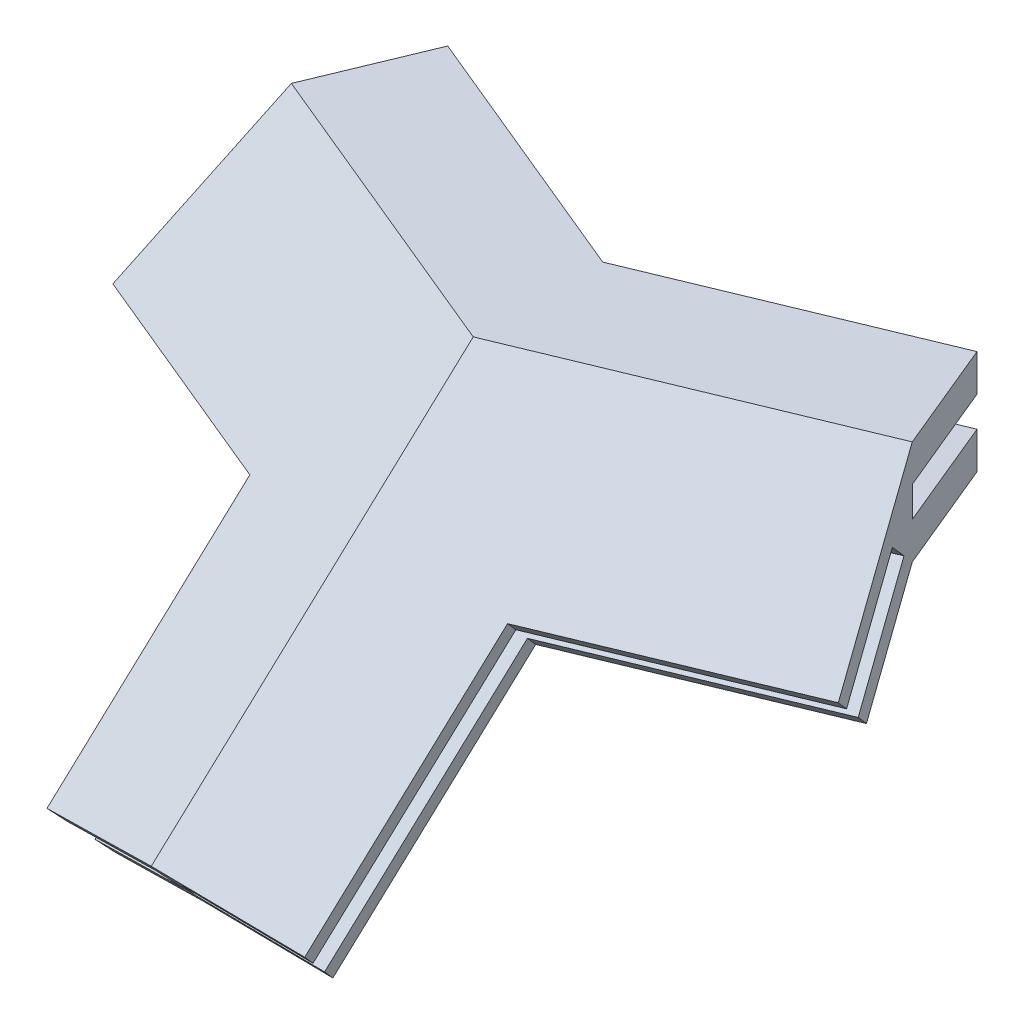
ISO-10303-21;
HEADER;
FILE_DESCRIPTION(('STEP AP214'),'2;1');
FILE_NAME('part.step','',(''),(''),'','','');
FILE_SCHEMA(('AUTOMOTIVE_DESIGN { 1 0 10303 214 1 1 1 1 }'));
ENDSEC;
DATA;
#1=APPLICATION_CONTEXT('core data for automotive mechanical design processes');
#2=APPLICATION_PROTOCOL_DEFINITION('international standard','automotive_design',2000,#1);
#3=PRODUCT_CONTEXT('',#1,'mechanical');
#4=PRODUCT('Part','Part','',(#3));
#5=PRODUCT_RELATED_PRODUCT_CATEGORY('part','',(#4));
#6=PRODUCT_DEFINITION_FORMATION('','',#4);
#7=PRODUCT_DEFINITION_CONTEXT('part definition',#1,'design');
#8=PRODUCT_DEFINITION('design','',#6,#7);
#9=PRODUCT_DEFINITION_SHAPE('','',#8);
#10=(LENGTH_UNIT() NAMED_UNIT(*) SI_UNIT(.MILLI.,.METRE.));
#11=(NAMED_UNIT(*) PLANE_ANGLE_UNIT() SI_UNIT($,.RADIAN.));
#12=(NAMED_UNIT(*) SI_UNIT($,.STERADIAN.) SOLID_ANGLE_UNIT());
#13=UNCERTAINTY_MEASURE_WITH_UNIT(LENGTH_MEASURE(1.E-05),#10,'distance_accuracy_value','');
#14=(GEOMETRIC_REPRESENTATION_CONTEXT(3) GLOBAL_UNCERTAINTY_ASSIGNED_CONTEXT((#13)) GLOBAL_UNIT_ASSIGNED_CONTEXT((#10,
#11,#12)) REPRESENTATION_CONTEXT('',''));
#15=CARTESIAN_POINT('',(0.,0.,0.));
#16=DIRECTION('',(0.,0.,1.));
#17=DIRECTION('',(1.,0.,0.));
#18=AXIS2_PLACEMENT_3D('',#15,#16,#17);
#19=CARTESIAN_POINT('',(-8.92826671022182,21.7801821562483,211.625005817447));
#20=DIRECTION('',(-0.270598050073097,0.707106781186551,-0.653281482438185));
#21=DIRECTION('',(0.,0.678598344545844,0.734509555267758));
#22=AXIS2_PLACEMENT_3D('',#19,#20,#21);
#23=PLANE('',#22);
#24=DIRECTION('',(-0.2705980500731,-0.707106781186544,-0.653281482438191));
#25=VECTOR('',#24,1.);
#26=CARTESIAN_POINT('',(35.6172582293641,21.7801821562483,193.173645244441));
#27=LINE('',#26,#25);
#28=CARTESIAN_POINT('',(36.2531636470359,23.4418830920367,194.708856728171));
#29=VERTEX_POINT('',#28);
#30=CARTESIAN_POINT('',(35.6172582293641,21.7801821562483,193.173645244441));
#31=VERTEX_POINT('',#30);
#32=EDGE_CURVE('E462',#29,#31,#27,.T.);
#33=ORIENTED_EDGE('',*,*,#32,.F.);
#34=DIRECTION('',(0.923879532511287,0.,-0.38268343236509));
#35=VECTOR('',#34,1.);
#36=CARTESIAN_POINT('',(-8.29236129255004,23.4418830920367,213.160217301176));
#37=LINE('',#36,#35);
#38=CARTESIAN_POINT('',(10.8502543306543,23.4418830920367,205.23108629075));
#39=VERTEX_POINT('',#38);
#40=EDGE_CURVE('E553',#39,#29,#37,.T.);
#41=ORIENTED_EDGE('',*,*,#40,.F.);
#42=DIRECTION('',(0.270598050073085,0.707106781186539,0.653281482438203));
#43=VECTOR('',#42,1.);
#44=CARTESIAN_POINT('',(10.8502543306543,23.4418830920367,205.23108629075));
#45=LINE('',#44,#43);
#46=CARTESIAN_POINT('',(10.2143489129825,21.7801821562483,203.69587480702));
#47=VERTEX_POINT('',#46);
#48=EDGE_CURVE('E495',#47,#39,#45,.T.);
#49=ORIENTED_EDGE('',*,*,#48,.F.);
#50=DIRECTION('',(0.923879532511287,0.,-0.38268343236509));
#51=VECTOR('',#50,1.);
#52=CARTESIAN_POINT('',(-8.92826671022182,21.7801821562483,211.625005817447));
#53=LINE('',#52,#51);
#54=EDGE_CURVE('E558',#47,#31,#53,.T.);
#55=ORIENTED_EDGE('',*,*,#54,.T.);
#56=EDGE_LOOP('',(#33,#41,#49,#55));
#57=FACE_BOUND('',#56,.T.);
#58=ADVANCED_FACE('F39',(#57),#23,.F.);
#59=DIRECTION('',(-0.2705980500731,-0.707106781186544,-0.653281482438191));
#60=VECTOR('',#59,1.);
#61=CARTESIAN_POINT('',(35.6172582293641,21.7801821562483,193.173645244441));
#62=LINE('',#61,#60);
#63=CARTESIAN_POINT('',(34.7269076718449,19.4535840278251,191.024148853212));
#64=VERTEX_POINT('',#63);
#65=CARTESIAN_POINT('',(34.0910022541732,17.7918830920368,189.488937369482));
#66=VERTEX_POINT('',#65);
#67=EDGE_CURVE('E447',#64,#66,#62,.T.);
#68=ORIENTED_EDGE('',*,*,#67,.F.);
#69=DIRECTION('',(0.923879532511287,0.,-0.38268343236509));
#70=VECTOR('',#69,1.);
#71=CARTESIAN_POINT('',(-9.81861726774101,19.4535840278251,209.475509426217));
#72=LINE('',#71,#70);
#73=CARTESIAN_POINT('',(9.32399835546334,19.4535840278251,201.546378415791));
#74=VERTEX_POINT('',#73);
#75=EDGE_CURVE('E569',#74,#64,#72,.T.);
#76=ORIENTED_EDGE('',*,*,#75,.F.);
#77=DIRECTION('',(0.270598050073098,0.707106781186542,0.653281482438194));
#78=VECTOR('',#77,1.);
#79=CARTESIAN_POINT('',(9.32399835546334,19.4535840278251,201.546378415791));
#80=LINE('',#79,#78);
#81=CARTESIAN_POINT('',(8.68809293779155,17.7918830920367,200.011166932061));
#82=VERTEX_POINT('',#81);
#83=EDGE_CURVE('E500',#82,#74,#80,.T.);
#84=ORIENTED_EDGE('',*,*,#83,.F.);
#85=DIRECTION('',(0.923879532511287,0.,-0.38268343236509));
#86=VECTOR('',#85,1.);
#87=CARTESIAN_POINT('',(-10.4545226854128,17.7918830920367,207.940297942488));
#88=LINE('',#87,#86);
#89=EDGE_CURVE('E535',#82,#66,#88,.T.);
#90=ORIENTED_EDGE('',*,*,#89,.T.);
#91=EDGE_LOOP('',(#68,#76,#84,#90));
#92=FACE_BOUND('',#91,.T.);
#93=ADVANCED_FACE('F613',(#92),#23,.F.);
#94=CARTESIAN_POINT('',(-12.4460413611721,30.9725703116735,203.13234654575));
#95=DIRECTION('',(0.270598050073101,0.70710678118654,0.653281482438195));
#96=DIRECTION('',(0.,-0.678598344545855,0.734509555267749));
#97=AXIS2_PLACEMENT_3D('',#94,#95,#96);
#98=PLANE('',#97);
#99=DIRECTION('',(-0.270598050073096,0.707106781186555,-0.653281482438182));
#100=VECTOR('',#99,1.);
#101=CARTESIAN_POINT('',(32.0994835784139,30.9725703116735,184.680985972745));
#102=LINE('',#101,#100);
#103=CARTESIAN_POINT('',(32.0994835784139,30.9725703116735,184.680985972745));
#104=VERTEX_POINT('',#103);
#105=EDGE_CURVE('E459',#31,#104,#102,.T.);
#106=ORIENTED_EDGE('',*,*,#105,.F.);
#107=ORIENTED_EDGE('',*,*,#54,.F.);
#108=DIRECTION('',(0.,0.678598344545852,-0.734509555267751));
#109=VECTOR('',#108,1.);
#110=CARTESIAN_POINT('',(10.2143489129825,1.42223181987276,225.731161465053));
#111=LINE('',#110,#109);
#112=CARTESIAN_POINT('',(10.2143489129825,1.42223181987276,225.731161465053));
#113=VERTEX_POINT('',#112);
#114=EDGE_CURVE('E518',#113,#47,#111,.T.);
#115=ORIENTED_EDGE('',*,*,#114,.F.);
#116=DIRECTION('',(-0.962692419881156,0.198756853415516,0.18362738881694));
#117=VECTOR('',#116,1.);
#118=CARTESIAN_POINT('',(-12.4460413611722,6.10068131739188,230.053485199699));
#119=LINE('',#118,#117);
#120=CARTESIAN_POINT('',(-1.79608500966418,3.90189822766997,228.022074506673));
#121=VERTEX_POINT('',#120);
#122=EDGE_CURVE('E488',#113,#121,#119,.T.);
#123=ORIENTED_EDGE('',*,*,#122,.T.);
#124=DIRECTION('',(0.,0.678598344545852,-0.734509555267751));
#125=VECTOR('',#124,1.);
#126=CARTESIAN_POINT('',(-1.79608500966419,19.2194404578549,211.442486269071));
#127=LINE('',#126,#125);
#128=CARTESIAN_POINT('',(-1.7960850096642,30.9725703116735,198.720990186274));
#129=VERTEX_POINT('',#128);
#130=EDGE_CURVE('E62',#121,#129,#127,.T.);
#131=ORIENTED_EDGE('',*,*,#130,.T.);
#132=DIRECTION('',(0.923879532511287,0.,-0.38268343236509));
#133=VECTOR('',#132,1.);
#134=CARTESIAN_POINT('',(-12.4460413611721,30.9725703116735,203.13234654575));
#135=LINE('',#134,#133);
#136=EDGE_CURVE('E562',#129,#104,#135,.T.);
#137=ORIENTED_EDGE('',*,*,#136,.T.);
#138=EDGE_LOOP('',(#106,#107,#115,#123,#131,#137));
#139=FACE_BOUND('',#138,.T.);
#140=ADVANCED_FACE('F598',(#139),#98,.F.);
#141=CARTESIAN_POINT('',(-13.3363919186913,28.6459721832503,200.982850154521));
#142=DIRECTION('',(-0.270598050073094,0.707106781186558,-0.653281482438178));
#143=DIRECTION('',(0.,0.678598344545836,0.734509555267766));
#144=AXIS2_PLACEMENT_3D('',#141,#142,#143);
#145=PLANE('',#144);
#146=DIRECTION('',(-0.270598050073103,-0.707106781186537,-0.653281482438198));
#147=VECTOR('',#146,1.);
#148=CARTESIAN_POINT('',(31.2091330208947,28.6459721832503,182.531489581516));
#149=LINE('',#148,#147);
#150=CARTESIAN_POINT('',(31.2091330208947,28.6459721832503,182.531489581516));
#151=VERTEX_POINT('',#150);
#152=EDGE_CURVE('E456',#104,#151,#149,.T.);
#153=ORIENTED_EDGE('',*,*,#152,.F.);
#154=ORIENTED_EDGE('',*,*,#136,.F.);
#155=DIRECTION('',(0.270598050073097,0.70710678118654,0.653281482438198));
#156=VECTOR('',#155,1.);
#157=CARTESIAN_POINT('',(-2.68643556718339,28.6459721832503,196.571493795045));
#158=LINE('',#157,#156);
#159=CARTESIAN_POINT('',(-2.6864355671834,28.6459721832503,196.571493795045));
#160=VERTEX_POINT('',#159);
#161=EDGE_CURVE('E521',#160,#129,#158,.T.);
#162=ORIENTED_EDGE('',*,*,#161,.F.);
#163=DIRECTION('',(0.923879532511287,0.,-0.38268343236509));
#164=VECTOR('',#163,1.);
#165=CARTESIAN_POINT('',(-13.3363919186913,28.6459721832503,200.982850154521));
#166=LINE('',#165,#164);
#167=EDGE_CURVE('E565',#160,#151,#166,.T.);
#168=ORIENTED_EDGE('',*,*,#167,.T.);
#169=EDGE_LOOP('',(#153,#154,#162,#168));
#170=FACE_BOUND('',#169,.T.);
#171=ADVANCED_FACE('F603',(#170),#145,.F.);
#172=CARTESIAN_POINT('',(-9.81861726774101,19.4535840278251,209.475509426217));
#173=DIRECTION('',(-0.2705980500731,-0.707106781186542,-0.653281482438193));
#174=DIRECTION('',(0.,0.678598344545852,-0.734509555267751));
#175=AXIS2_PLACEMENT_3D('',#172,#173,#174);
#176=PLANE('',#175);
#177=DIRECTION('',(0.270598050073097,-0.707106781186553,0.653281482438184));
#178=VECTOR('',#177,1.);
#179=CARTESIAN_POINT('',(34.7269076718449,19.4535840278251,191.024148853212));
#180=LINE('',#179,#178);
#181=EDGE_CURVE('E453',#151,#64,#180,.T.);
#182=ORIENTED_EDGE('',*,*,#181,.F.);
#183=ORIENTED_EDGE('',*,*,#167,.F.);
#184=DIRECTION('',(0.,0.678598344545852,-0.734509555267751));
#185=VECTOR('',#184,1.);
#186=CARTESIAN_POINT('',(-2.68643556718339,16.8928423294316,209.292989877842));
#187=LINE('',#186,#185);
#188=CARTESIAN_POINT('',(-2.6864355671834,1.57530009924667,225.872578115443));
#189=VERTEX_POINT('',#188);
#190=EDGE_CURVE('E527',#189,#160,#187,.T.);
#191=ORIENTED_EDGE('',*,*,#190,.F.);
#192=DIRECTION('',(0.962692419881156,-0.198756853415515,-0.18362738881694));
#193=VECTOR('',#192,1.);
#194=CARTESIAN_POINT('',(-9.81861726774106,3.04780571320541,227.232995913688));
#195=LINE('',#194,#193);
#196=CARTESIAN_POINT('',(9.32399835546331,-0.904366308550453,223.581665073824));
#197=VERTEX_POINT('',#196);
#198=EDGE_CURVE('E484',#189,#197,#195,.T.);
#199=ORIENTED_EDGE('',*,*,#198,.T.);
#200=DIRECTION('',(0.,0.678598344545852,-0.734509555267751));
#201=VECTOR('',#200,1.);
#202=CARTESIAN_POINT('',(9.32399835546333,-0.904366308550425,223.581665073824));
#203=LINE('',#202,#201);
#204=EDGE_CURVE('E503',#197,#74,#203,.T.);
#205=ORIENTED_EDGE('',*,*,#204,.T.);
#206=ORIENTED_EDGE('',*,*,#75,.T.);
#207=EDGE_LOOP('',(#182,#183,#191,#199,#205,#206));
#208=FACE_BOUND('',#207,.T.);
#209=ADVANCED_FACE('F608',(#208),#176,.F.);
#210=CARTESIAN_POINT('',(-13.972297336363,38.284271247462,187.216606807487));
#211=DIRECTION('',(0.2705980500731,0.707106781186546,0.653281482438189));
#212=DIRECTION('',(0.,-0.678598344545848,0.734509555267754));
#213=AXIS2_PLACEMENT_3D('',#210,#211,#212);
#214=PLANE('',#213);
#215=DIRECTION('',(-0.270598050073098,0.707106781186549,-0.653281482438187));
#216=VECTOR('',#215,1.);
#217=CARTESIAN_POINT('',(26.2489048174974,38.2842712474619,170.556439380408));
#218=LINE('',#217,#216);
#219=CARTESIAN_POINT('',(30.5732276032229,26.9842712474619,180.996278097786));
#220=VERTEX_POINT('',#219);
#221=EDGE_CURVE('E444',#66,#220,#218,.T.);
#222=ORIENTED_EDGE('',*,*,#221,.F.);
#223=ORIENTED_EDGE('',*,*,#89,.F.);
#224=DIRECTION('',(0.,0.678598344545852,-0.734509555267751));
#225=VECTOR('',#224,1.);
#226=CARTESIAN_POINT('',(8.68809293779154,-2.56606724433883,222.046453590094));
#227=LINE('',#226,#225);
#228=CARTESIAN_POINT('',(8.68809293779154,-2.56606724433883,222.046453590094));
#229=VERTEX_POINT('',#228);
#230=EDGE_CURVE('E511',#229,#82,#227,.T.);
#231=ORIENTED_EDGE('',*,*,#230,.F.);
#232=DIRECTION('',(0.962692419881156,-0.198756853415515,-0.18362738881694));
#233=VECTOR('',#232,1.);
#234=CARTESIAN_POINT('',(8.68809293779161,-2.56606724433861,222.046453590094));
#235=LINE('',#234,#233);
#236=CARTESIAN_POINT('',(-3.14837533343908,-0.122317672244938,224.304183802335));
#237=VERTEX_POINT('',#236);
#238=EDGE_CURVE('E477',#237,#229,#235,.T.);
#239=ORIENTED_EDGE('',*,*,#238,.F.);
#240=DIRECTION('',(0.,0.678598344545848,-0.734509555267754));
#241=VECTOR('',#240,1.);
#242=CARTESIAN_POINT('',(-3.14837533343908,-8.0485775527046,232.883505674435));
#243=LINE('',#242,#241);
#244=CARTESIAN_POINT('',(-3.14837533343909,26.9842712474619,194.964223379112));
#245=VERTEX_POINT('',#244);
#246=EDGE_CURVE('E429',#237,#245,#243,.T.);
#247=ORIENTED_EDGE('',*,*,#246,.T.);
#248=DIRECTION('',(0.923879532511287,0.,-0.38268343236509));
#249=VECTOR('',#248,1.);
#250=CARTESIAN_POINT('',(-13.972297336363,26.9842712474619,199.447638670791));
#251=LINE('',#250,#249);
#252=EDGE_CURVE('E557',#245,#220,#251,.T.);
#253=ORIENTED_EDGE('',*,*,#252,.T.);
#254=EDGE_LOOP('',(#222,#223,#231,#239,#247,#253));
#255=FACE_BOUND('',#254,.T.);
#256=ADVANCED_FACE('F41',(#255),#214,.F.);
#257=CARTESIAN_POINT('',(93.0724640005659,38.284271247462,155.108246744044));
#258=DIRECTION('',(-0.270598050073099,-0.707106781186546,-0.653281482438189));
#259=DIRECTION('',(0.,0.678598344545848,-0.734509555267754));
#260=AXIS2_PLACEMENT_3D('',#257,#258,#259);
#261=PLANE('',#260);
#262=DIRECTION('',(0.270598050073098,-0.707106781186549,0.653281482438187));
#263=VECTOR('',#262,1.);
#264=CARTESIAN_POINT('',(30.5732276032229,38.284271247462,180.996278097786));
#265=LINE('',#264,#263);
#266=CARTESIAN_POINT('',(30.5732276032229,38.284271247462,180.996278097786));
#267=VERTEX_POINT('',#266);
#268=EDGE_CURVE('E468',#267,#29,#265,.T.);
#269=ORIENTED_EDGE('',*,*,#268,.F.);
#270=DIRECTION('',(0.923879532511287,0.,-0.38268343236509));
#271=VECTOR('',#270,1.);
#272=CARTESIAN_POINT('',(93.0724640005659,38.284271247462,155.108246744044));
#273=LINE('',#272,#271);
#274=CARTESIAN_POINT('',(-3.14837533343907,38.284271247462,194.964223379112));
#275=VERTEX_POINT('',#274);
#276=EDGE_CURVE('E48',#275,#267,#273,.T.);
#277=ORIENTED_EDGE('',*,*,#276,.F.);
#278=DIRECTION('',(0.,-0.678598344545848,0.734509555267754));
#279=VECTOR('',#278,1.);
#280=CARTESIAN_POINT('',(-3.14837533343908,-5.16386609532728,241.992148356179));
#281=LINE('',#280,#279);
#282=CARTESIAN_POINT('',(-3.14837533343908,5.9740807683649,229.936521543648));
#283=VERTEX_POINT('',#282);
#284=EDGE_CURVE('E430',#275,#283,#281,.T.);
#285=ORIENTED_EDGE('',*,*,#284,.T.);
#286=DIRECTION('',(0.962692419881156,-0.198756853415514,-0.183627388816939));
#287=VECTOR('',#286,1.);
#288=CARTESIAN_POINT('',(93.0724640005659,-13.8916113925721,211.583015156988));
#289=LINE('',#288,#287);
#290=CARTESIAN_POINT('',(10.8502543306543,3.0839327556612,227.266372948783));
#291=VERTEX_POINT('',#290);
#292=EDGE_CURVE('E491',#283,#291,#289,.T.);
#293=ORIENTED_EDGE('',*,*,#292,.T.);
#294=DIRECTION('',(0.,0.678598344545852,-0.734509555267751));
#295=VECTOR('',#294,1.);
#296=CARTESIAN_POINT('',(10.8502543306543,3.08393275566117,227.266372948783));
#297=LINE('',#296,#295);
#298=EDGE_CURVE('E514',#291,#39,#297,.T.);
#299=ORIENTED_EDGE('',*,*,#298,.T.);
#300=ORIENTED_EDGE('',*,*,#40,.T.);
#301=EDGE_LOOP('',(#269,#277,#285,#293,#299,#300));
#302=FACE_BOUND('',#301,.T.);
#303=ADVANCED_FACE('F588',(#302),#261,.F.);
#304=CARTESIAN_POINT('',(-20.3691297898681,38.284271247462,153.389644416104));
#305=DIRECTION('',(0.,-1.,0.));
#306=DIRECTION('',(0.,0.,-1.));
#307=AXIS2_PLACEMENT_3D('',#304,#305,#306);
#308=PLANE('',#307);
#309=DIRECTION('',(0.38268343236509,0.,0.923879532511287));
#310=VECTOR('',#309,1.);
#311=CARTESIAN_POINT('',(13.3524731467939,38.284271247462,139.421699134778));
#312=LINE('',#311,#310);
#313=CARTESIAN_POINT('',(25.5983429824767,38.284271247462,168.985844175139));
#314=VERTEX_POINT('',#313);
#315=EDGE_CURVE('E474',#314,#267,#312,.T.);
#316=ORIENTED_EDGE('',*,*,#315,.F.);
#317=DIRECTION('',(0.923879532511287,0.,-0.38268343236509));
#318=VECTOR('',#317,1.);
#319=CARTESIAN_POINT('',(-13.8031959979982,38.284271247462,185.306495999224));
#320=LINE('',#319,#318);
#321=CARTESIAN_POINT('',(-3.14837533343908,38.284271247462,180.89312477531));
#322=VERTEX_POINT('',#321);
#323=EDGE_CURVE('E530',#322,#314,#320,.T.);
#324=ORIENTED_EDGE('',*,*,#323,.F.);
#325=DIRECTION('',(-0.923879532511287,0.,-0.38268343236509));
#326=VECTOR('',#325,1.);
#327=CARTESIAN_POINT('',(7.50644533112007,38.284271247462,185.306495999224));
#328=LINE('',#327,#326);
#329=CARTESIAN_POINT('',(-31.8950936493549,38.284271247462,168.985844175139));
#330=VERTEX_POINT('',#329);
#331=EDGE_CURVE('E374',#322,#330,#328,.T.);
#332=ORIENTED_EDGE('',*,*,#331,.T.);
#333=DIRECTION('',(-0.38268343236509,0.,0.923879532511287));
#334=VECTOR('',#333,1.);
#335=CARTESIAN_POINT('',(-19.649223813672,38.284271247462,139.421699134778));
#336=LINE('',#335,#334);
#337=CARTESIAN_POINT('',(-36.8699782701011,38.284271247462,180.996278097786));
#338=VERTEX_POINT('',#337);
#339=EDGE_CURVE('E316',#330,#338,#336,.T.);
#340=ORIENTED_EDGE('',*,*,#339,.T.);
#341=DIRECTION('',(-0.923879532511287,0.,-0.38268343236509));
#342=VECTOR('',#341,1.);
#343=CARTESIAN_POINT('',(-99.3692146674441,38.284271247462,155.108246744044));
#344=LINE('',#343,#342);
#345=EDGE_CURVE('E256',#275,#338,#344,.T.);
#346=ORIENTED_EDGE('',*,*,#345,.F.);
#347=ORIENTED_EDGE('',*,*,#276,.T.);
#348=EDGE_LOOP('',(#316,#324,#332,#340,#346,#347));
#349=FACE_BOUND('',#348,.T.);
#350=ADVANCED_FACE('F583',(#349),#308,.F.);
#351=CARTESIAN_POINT('',(75.8517095441369,26.9842712474619,113.533667781036));
#352=DIRECTION('',(0.,1.,0.));
#353=DIRECTION('',(0.,0.,1.));
#354=AXIS2_PLACEMENT_3D('',#351,#352,#353);
#355=PLANE('',#354);
#356=DIRECTION('',(-0.38268343236509,0.,-0.923879532511287));
#357=VECTOR('',#356,1.);
#358=CARTESIAN_POINT('',(13.3524731467939,26.9842712474619,139.421699134778));
#359=LINE('',#358,#357);
#360=CARTESIAN_POINT('',(25.5983429824767,26.9842712474619,168.985844175139));
#361=VERTEX_POINT('',#360);
#362=EDGE_CURVE('E54',#220,#361,#359,.T.);
#363=ORIENTED_EDGE('',*,*,#362,.F.);
#364=ORIENTED_EDGE('',*,*,#252,.F.);
#365=DIRECTION('',(-0.923879532511287,0.,-0.38268343236509));
#366=VECTOR('',#365,1.);
#367=CARTESIAN_POINT('',(7.67554666948487,26.9842712474619,199.447638670791));
#368=LINE('',#367,#366);
#369=CARTESIAN_POINT('',(-36.8699782701011,26.9842712474619,180.996278097786));
#370=VERTEX_POINT('',#369);
#371=EDGE_CURVE('E406',#245,#370,#368,.T.);
#372=ORIENTED_EDGE('',*,*,#371,.T.);
#373=DIRECTION('',(0.38268343236509,0.,-0.923879532511287));
#374=VECTOR('',#373,1.);
#375=CARTESIAN_POINT('',(-19.649223813672,26.9842712474619,139.421699134778));
#376=LINE('',#375,#374);
#377=CARTESIAN_POINT('',(-31.8950936493549,26.9842712474619,168.985844175139));
#378=VERTEX_POINT('',#377);
#379=EDGE_CURVE('E276',#370,#378,#376,.T.);
#380=ORIENTED_EDGE('',*,*,#379,.T.);
#381=DIRECTION('',(-0.923879532511287,0.,-0.38268343236509));
#382=VECTOR('',#381,1.);
#383=CARTESIAN_POINT('',(7.50644533112007,26.9842712474619,185.306495999224));
#384=LINE('',#383,#382);
#385=CARTESIAN_POINT('',(-3.14837533343907,26.9842712474619,180.89312477531));
#386=VERTEX_POINT('',#385);
#387=EDGE_CURVE('E250',#386,#378,#384,.T.);
#388=ORIENTED_EDGE('',*,*,#387,.F.);
#389=DIRECTION('',(0.923879532511287,0.,-0.38268343236509));
#390=VECTOR('',#389,1.);
#391=CARTESIAN_POINT('',(-13.8031959979982,26.9842712474619,185.306495999224));
#392=LINE('',#391,#390);
#393=EDGE_CURVE('E531',#386,#361,#392,.T.);
#394=ORIENTED_EDGE('',*,*,#393,.T.);
#395=EDGE_LOOP('',(#363,#364,#372,#380,#388,#394));
#396=FACE_BOUND('',#395,.T.);
#397=ADVANCED_FACE('F620',(#396),#355,.F.);
#398=CARTESIAN_POINT('',(-8.82831137725207,30.9842712474619,197.316929921871));
#399=DIRECTION('',(0.,-1.,0.));
#400=DIRECTION('',(0.,0.,-1.));
#401=AXIS2_PLACEMENT_3D('',#398,#399,#400);
#402=PLANE('',#401);
#403=DIRECTION('',(0.38268343236509,0.,0.923879532511287));
#404=VECTOR('',#403,1.);
#405=CARTESIAN_POINT('',(30.5732276032229,30.9842712474619,180.996278097786));
#406=LINE('',#405,#404);
#407=CARTESIAN_POINT('',(25.5983429824767,30.9842712474619,168.985844175139));
#408=VERTEX_POINT('',#407);
#409=CARTESIAN_POINT('',(30.5732276032229,30.9842712474619,180.996278097786));
#410=VERTEX_POINT('',#409);
#411=EDGE_CURVE('E255',#408,#410,#406,.T.);
#412=ORIENTED_EDGE('',*,*,#411,.F.);
#413=DIRECTION('',(0.923879532511287,0.,-0.38268343236509));
#414=VECTOR('',#413,1.);
#415=CARTESIAN_POINT('',(-13.8031959979982,30.9842712474619,185.306495999224));
#416=LINE('',#415,#414);
#417=CARTESIAN_POINT('',(-3.14837533343908,30.9842712474619,180.89312477531));
#418=VERTEX_POINT('',#417);
#419=EDGE_CURVE('E266',#418,#408,#416,.T.);
#420=ORIENTED_EDGE('',*,*,#419,.F.);
#421=DIRECTION('',(-0.923879532511287,0.,-0.38268343236509));
#422=VECTOR('',#421,1.);
#423=CARTESIAN_POINT('',(7.50644533112007,30.9842712474619,185.306495999224));
#424=LINE('',#423,#422);
#425=CARTESIAN_POINT('',(-31.8950936493549,30.9842712474619,168.985844175139));
#426=VERTEX_POINT('',#425);
#427=EDGE_CURVE('E248',#418,#426,#424,.T.);
#428=ORIENTED_EDGE('',*,*,#427,.T.);
#429=DIRECTION('',(-0.38268343236509,0.,0.923879532511287));
#430=VECTOR('',#429,1.);
#431=CARTESIAN_POINT('',(-36.8699782701011,30.9842712474619,180.996278097786));
#432=LINE('',#431,#430);
#433=CARTESIAN_POINT('',(-36.8699782701011,30.9842712474619,180.996278097786));
#434=VERTEX_POINT('',#433);
#435=EDGE_CURVE('E264',#426,#434,#432,.T.);
#436=ORIENTED_EDGE('',*,*,#435,.T.);
#437=DIRECTION('',(-0.923879532511287,0.,-0.38268343236509));
#438=VECTOR('',#437,1.);
#439=CARTESIAN_POINT('',(2.53156071037391,30.9842712474619,197.316929921871));
#440=LINE('',#439,#438);
#441=CARTESIAN_POINT('',(-3.14837533343907,30.9842712474619,194.964223379112));
#442=VERTEX_POINT('',#441);
#443=EDGE_CURVE('E268',#442,#434,#440,.T.);
#444=ORIENTED_EDGE('',*,*,#443,.F.);
#445=DIRECTION('',(0.923879532511287,0.,-0.38268343236509));
#446=VECTOR('',#445,1.);
#447=CARTESIAN_POINT('',(-8.82831137725207,30.9842712474619,197.316929921871));
#448=LINE('',#447,#446);
#449=EDGE_CURVE('E538',#442,#410,#448,.T.);
#450=ORIENTED_EDGE('',*,*,#449,.T.);
#451=EDGE_LOOP('',(#412,#420,#428,#436,#444,#450));
#452=FACE_BOUND('',#451,.T.);
#453=ADVANCED_FACE('F262',(#452),#402,.F.);
#454=CARTESIAN_POINT('',(-8.82831137725207,34.284271247462,197.316929921871));
#455=DIRECTION('',(0.38268343236509,0.,0.923879532511287));
#456=DIRECTION('',(0.923879532511287,0.,-0.38268343236509));
#457=AXIS2_PLACEMENT_3D('',#454,#455,#456);
#458=PLANE('',#457);
#459=DIRECTION('',(0.,1.,0.));
#460=VECTOR('',#459,1.);
#461=CARTESIAN_POINT('',(30.5732276032229,34.284271247462,180.996278097786));
#462=LINE('',#461,#460);
#463=CARTESIAN_POINT('',(30.5732276032229,34.284271247462,180.996278097786));
#464=VERTEX_POINT('',#463);
#465=EDGE_CURVE('E450',#410,#464,#462,.T.);
#466=ORIENTED_EDGE('',*,*,#465,.F.);
#467=ORIENTED_EDGE('',*,*,#449,.F.);
#468=DIRECTION('',(0.,-1.,0.));
#469=VECTOR('',#468,1.);
#470=CARTESIAN_POINT('',(-3.14837533343908,0.,194.964223379112));
#471=LINE('',#470,#469);
#472=CARTESIAN_POINT('',(-3.14837533343908,34.284271247462,194.964223379112));
#473=VERTEX_POINT('',#472);
#474=EDGE_CURVE('E397',#473,#442,#471,.T.);
#475=ORIENTED_EDGE('',*,*,#474,.F.);
#476=DIRECTION('',(0.923879532511287,0.,-0.38268343236509));
#477=VECTOR('',#476,1.);
#478=CARTESIAN_POINT('',(-8.82831137725207,34.284271247462,197.316929921871));
#479=LINE('',#478,#477);
#480=EDGE_CURVE('E542',#473,#464,#479,.T.);
#481=ORIENTED_EDGE('',*,*,#480,.T.);
#482=EDGE_LOOP('',(#466,#467,#475,#481));
#483=FACE_BOUND('',#482,.T.);
#484=ADVANCED_FACE('F625',(#483),#458,.F.);
#485=CARTESIAN_POINT('',(-13.8031959979982,34.284271247462,185.306495999224));
#486=DIRECTION('',(0.,1.,0.));
#487=DIRECTION('',(0.,0.,1.));
#488=AXIS2_PLACEMENT_3D('',#485,#486,#487);
#489=PLANE('',#488);
#490=DIRECTION('',(-0.38268343236509,0.,-0.923879532511287));
#491=VECTOR('',#490,1.);
#492=CARTESIAN_POINT('',(25.5983429824767,34.284271247462,168.985844175139));
#493=LINE('',#492,#491);
#494=CARTESIAN_POINT('',(25.5983429824767,34.284271247462,168.985844175139));
#495=VERTEX_POINT('',#494);
#496=EDGE_CURVE('E465',#464,#495,#493,.T.);
#497=ORIENTED_EDGE('',*,*,#496,.F.);
#498=ORIENTED_EDGE('',*,*,#480,.F.);
#499=DIRECTION('',(-0.923879532511287,0.,-0.38268343236509));
#500=VECTOR('',#499,1.);
#501=CARTESIAN_POINT('',(2.53156071037391,34.284271247462,197.316929921871));
#502=LINE('',#501,#500);
#503=CARTESIAN_POINT('',(-36.8699782701011,34.284271247462,180.996278097786));
#504=VERTEX_POINT('',#503);
#505=EDGE_CURVE('E380',#473,#504,#502,.T.);
#506=ORIENTED_EDGE('',*,*,#505,.T.);
#507=DIRECTION('',(0.38268343236509,0.,-0.923879532511287));
#508=VECTOR('',#507,1.);
#509=CARTESIAN_POINT('',(-31.8950936493549,34.284271247462,168.985844175139));
#510=LINE('',#509,#508);
#511=CARTESIAN_POINT('',(-31.8950936493549,34.284271247462,168.985844175139));
#512=VERTEX_POINT('',#511);
#513=EDGE_CURVE('E306',#504,#512,#510,.T.);
#514=ORIENTED_EDGE('',*,*,#513,.T.);
#515=DIRECTION('',(-0.923879532511287,0.,-0.38268343236509));
#516=VECTOR('',#515,1.);
#517=CARTESIAN_POINT('',(7.50644533112007,34.284271247462,185.306495999224));
#518=LINE('',#517,#516);
#519=CARTESIAN_POINT('',(-3.14837533343907,34.284271247462,180.89312477531));
#520=VERTEX_POINT('',#519);
#521=EDGE_CURVE('E384',#520,#512,#518,.T.);
#522=ORIENTED_EDGE('',*,*,#521,.F.);
#523=DIRECTION('',(0.923879532511287,0.,-0.38268343236509));
#524=VECTOR('',#523,1.);
#525=CARTESIAN_POINT('',(-13.8031959979982,34.284271247462,185.306495999224));
#526=LINE('',#525,#524);
#527=EDGE_CURVE('E546',#520,#495,#526,.T.);
#528=ORIENTED_EDGE('',*,*,#527,.T.);
#529=EDGE_LOOP('',(#497,#498,#506,#514,#522,#528));
#530=FACE_BOUND('',#529,.T.);
#531=ADVANCED_FACE('F632',(#530),#489,.F.);
#532=CARTESIAN_POINT('',(-13.8031959979982,38.284271247462,185.306495999224));
#533=DIRECTION('',(0.38268343236509,0.,0.923879532511287));
#534=DIRECTION('',(0.923879532511287,0.,-0.38268343236509));
#535=AXIS2_PLACEMENT_3D('',#532,#533,#534);
#536=PLANE('',#535);
#537=DIRECTION('',(0.,1.,0.));
#538=VECTOR('',#537,1.);
#539=CARTESIAN_POINT('',(25.5983429824767,38.284271247462,168.985844175139));
#540=LINE('',#539,#538);
#541=EDGE_CURVE('E471',#495,#314,#540,.T.);
#542=ORIENTED_EDGE('',*,*,#541,.F.);
#543=ORIENTED_EDGE('',*,*,#527,.F.);
#544=DIRECTION('',(0.,-1.,0.));
#545=VECTOR('',#544,1.);
#546=CARTESIAN_POINT('',(-3.14837533343908,0.,180.89312477531));
#547=LINE('',#546,#545);
#548=EDGE_CURVE('E393',#322,#520,#547,.T.);
#549=ORIENTED_EDGE('',*,*,#548,.F.);
#550=ORIENTED_EDGE('',*,*,#323,.T.);
#551=EDGE_LOOP('',(#542,#543,#549,#550));
#552=FACE_BOUND('',#551,.T.);
#553=ADVANCED_FACE('F636',(#552),#536,.F.);
#554=CARTESIAN_POINT('',(-13.8031959979982,30.9842712474619,185.306495999224));
#555=DIRECTION('',(0.38268343236509,0.,0.923879532511287));
#556=DIRECTION('',(0.923879532511287,0.,-0.38268343236509));
#557=AXIS2_PLACEMENT_3D('',#554,#555,#556);
#558=PLANE('',#557);
#559=DIRECTION('',(0.,1.,0.));
#560=VECTOR('',#559,1.);
#561=CARTESIAN_POINT('',(25.5983429824767,30.9842712474619,168.985844175139));
#562=LINE('',#561,#560);
#563=EDGE_CURVE('E11',#361,#408,#562,.T.);
#564=ORIENTED_EDGE('',*,*,#563,.F.);
#565=ORIENTED_EDGE('',*,*,#393,.F.);
#566=DIRECTION('',(0.,-1.,0.));
#567=VECTOR('',#566,1.);
#568=CARTESIAN_POINT('',(-3.14837533343908,0.,180.89312477531));
#569=LINE('',#568,#567);
#570=EDGE_CURVE('E376',#418,#386,#569,.T.);
#571=ORIENTED_EDGE('',*,*,#570,.F.);
#572=ORIENTED_EDGE('',*,*,#419,.T.);
#573=EDGE_LOOP('',(#564,#565,#571,#572));
#574=FACE_BOUND('',#573,.T.);
#575=ADVANCED_FACE('F622',(#574),#558,.F.);
#576=CARTESIAN_POINT('',(-2.68643556718339,16.8928423294316,209.292989877842));
#577=DIRECTION('',(-0.962692419881157,0.198756853415511,0.183627388816939));
#578=DIRECTION('',(-0.202194992907034,-0.9793452837704,0.));
#579=AXIS2_PLACEMENT_3D('',#576,#577,#578);
#580=PLANE('',#579);
#581=ORIENTED_EDGE('',*,*,#130,.F.);
#582=DIRECTION('',(-0.270598050073097,-0.707106781186547,-0.65328148243819));
#583=VECTOR('',#582,1.);
#584=CARTESIAN_POINT('',(-2.68643556718337,1.57530009924676,225.872578115443));
#585=LINE('',#584,#583);
#586=EDGE_CURVE('E480',#121,#189,#585,.T.);
#587=ORIENTED_EDGE('',*,*,#586,.T.);
#588=ORIENTED_EDGE('',*,*,#190,.T.);
#589=ORIENTED_EDGE('',*,*,#161,.T.);
#590=EDGE_LOOP('',(#581,#587,#588,#589));
#591=FACE_BOUND('',#590,.T.);
#592=ADVANCED_FACE('F654',(#591),#580,.F.);
#593=CARTESIAN_POINT('',(10.8502543306543,3.08393275566117,227.266372948783));
#594=DIRECTION('',(-0.96269241988116,0.198756853415502,0.183627388816931));
#595=DIRECTION('',(-0.202194992907024,-0.979345283770402,0.));
#596=AXIS2_PLACEMENT_3D('',#593,#594,#595);
#597=PLANE('',#596);
#598=ORIENTED_EDGE('',*,*,#48,.T.);
#599=ORIENTED_EDGE('',*,*,#298,.F.);
#600=DIRECTION('',(0.270598050073085,0.707106781186539,0.653281482438203));
#601=VECTOR('',#600,1.);
#602=CARTESIAN_POINT('',(10.8502543306543,3.08393275566117,227.266372948783));
#603=LINE('',#602,#601);
#604=EDGE_CURVE('E496',#113,#291,#603,.T.);
#605=ORIENTED_EDGE('',*,*,#604,.F.);
#606=ORIENTED_EDGE('',*,*,#114,.T.);
#607=EDGE_LOOP('',(#598,#599,#605,#606));
#608=FACE_BOUND('',#607,.T.);
#609=ADVANCED_FACE('F651',(#608),#597,.F.);
#610=CARTESIAN_POINT('',(9.32399835546333,-0.904366308550425,223.581665073824));
#611=DIRECTION('',(-0.962692419881157,0.198756853415512,0.183627388816939));
#612=DIRECTION('',(-0.202194992907034,-0.9793452837704,0.));
#613=AXIS2_PLACEMENT_3D('',#610,#611,#612);
#614=PLANE('',#613);
#615=ORIENTED_EDGE('',*,*,#83,.T.);
#616=ORIENTED_EDGE('',*,*,#204,.F.);
#617=DIRECTION('',(0.270598050073098,0.707106781186542,0.653281482438194));
#618=VECTOR('',#617,1.);
#619=CARTESIAN_POINT('',(9.32399835546333,-0.904366308550425,223.581665073824));
#620=LINE('',#619,#618);
#621=EDGE_CURVE('E499',#229,#197,#620,.T.);
#622=ORIENTED_EDGE('',*,*,#621,.F.);
#623=ORIENTED_EDGE('',*,*,#230,.T.);
#624=EDGE_LOOP('',(#615,#616,#622,#623));
#625=FACE_BOUND('',#624,.T.);
#626=ADVANCED_FACE('F653',(#625),#614,.F.);
#627=CARTESIAN_POINT('',(25.047059032881,40.1819712426853,261.54049140326));
#628=DIRECTION('',(0.,0.678598344545848,-0.734509555267754));
#629=DIRECTION('',(0.,0.734509555267754,0.678598344545848));
#630=AXIS2_PLACEMENT_3D('',#627,#628,#629);
#631=PLANE('',#630);
#632=ORIENTED_EDGE('',*,*,#292,.F.);
#633=DIRECTION('',(-0.962692419881156,-0.198756853415514,-0.183627388816939));
#634=VECTOR('',#633,1.);
#635=CARTESIAN_POINT('',(-99.369214667444,-13.8916113925721,211.583015156988));
#636=LINE('',#635,#634);
#637=CARTESIAN_POINT('',(-17.1470049975325,3.0839327556612,227.266372948783));
#638=VERTEX_POINT('',#637);
#639=EDGE_CURVE('E334',#283,#638,#636,.T.);
#640=ORIENTED_EDGE('',*,*,#639,.T.);
#641=DIRECTION('',(-0.270598050073085,0.707106781186539,0.653281482438203));
#642=VECTOR('',#641,1.);
#643=CARTESIAN_POINT('',(-17.1470049975325,3.08393275566117,227.266372948783));
#644=LINE('',#643,#642);
#645=CARTESIAN_POINT('',(-16.5110995798607,1.42223181987276,225.731161465053));
#646=VERTEX_POINT('',#645);
#647=EDGE_CURVE('E339',#646,#638,#644,.T.);
#648=ORIENTED_EDGE('',*,*,#647,.F.);
#649=DIRECTION('',(0.962692419881156,0.198756853415516,0.18362738881694));
#650=VECTOR('',#649,1.);
#651=CARTESIAN_POINT('',(6.149290694294,6.10068131739188,230.053485199699));
#652=LINE('',#651,#650);
#653=CARTESIAN_POINT('',(-4.50066565721398,3.90189822766997,228.022074506673));
#654=VERTEX_POINT('',#653);
#655=EDGE_CURVE('E330',#646,#654,#652,.T.);
#656=ORIENTED_EDGE('',*,*,#655,.T.);
#657=DIRECTION('',(0.270598050073097,-0.707106781186547,-0.65328148243819));
#658=VECTOR('',#657,1.);
#659=CARTESIAN_POINT('',(-3.61031509969479,1.57530009924676,225.872578115443));
#660=LINE('',#659,#658);
#661=CARTESIAN_POINT('',(-3.61031509969476,1.57530009924667,225.872578115443));
#662=VERTEX_POINT('',#661);
#663=EDGE_CURVE('E323',#654,#662,#660,.T.);
#664=ORIENTED_EDGE('',*,*,#663,.T.);
#665=DIRECTION('',(-0.962692419881156,-0.198756853415515,-0.18362738881694));
#666=VECTOR('',#665,1.);
#667=CARTESIAN_POINT('',(3.5218666008629,3.04780571320541,227.232995913688));
#668=LINE('',#667,#666);
#669=CARTESIAN_POINT('',(-15.6207490223415,-0.904366308550453,223.581665073824));
#670=VERTEX_POINT('',#669);
#671=EDGE_CURVE('E326',#662,#670,#668,.T.);
#672=ORIENTED_EDGE('',*,*,#671,.T.);
#673=DIRECTION('',(-0.270598050073098,0.707106781186542,0.653281482438194));
#674=VECTOR('',#673,1.);
#675=CARTESIAN_POINT('',(-15.6207490223415,-0.904366308550425,223.581665073824));
#676=LINE('',#675,#674);
#677=CARTESIAN_POINT('',(-14.9848436046697,-2.56606724433883,222.046453590094));
#678=VERTEX_POINT('',#677);
#679=EDGE_CURVE('E342',#678,#670,#676,.T.);
#680=ORIENTED_EDGE('',*,*,#679,.F.);
#681=DIRECTION('',(-0.962692419881156,-0.198756853415515,-0.18362738881694));
#682=VECTOR('',#681,1.);
#683=CARTESIAN_POINT('',(-14.9848436046698,-2.56606724433861,222.046453590094));
#684=LINE('',#683,#682);
#685=EDGE_CURVE('E319',#237,#678,#684,.T.);
#686=ORIENTED_EDGE('',*,*,#685,.F.);
#687=ORIENTED_EDGE('',*,*,#238,.T.);
#688=ORIENTED_EDGE('',*,*,#621,.T.);
#689=ORIENTED_EDGE('',*,*,#198,.F.);
#690=ORIENTED_EDGE('',*,*,#586,.F.);
#691=ORIENTED_EDGE('',*,*,#122,.F.);
#692=ORIENTED_EDGE('',*,*,#604,.T.);
#693=EDGE_LOOP('',(#632,#640,#648,#656,#664,#672,#680,#686,#687,#688,#689,#690,#691,#692));
#694=FACE_BOUND('',#693,.T.);
#695=ADVANCED_FACE('F647',(#694),#631,.F.);
#696=CARTESIAN_POINT('',(19.0927246322703,30.9842712474619,153.279892122447));
#697=DIRECTION('',(0.923879532511287,0.,-0.38268343236509));
#698=DIRECTION('',(-0.38268343236509,0.,-0.923879532511287));
#699=AXIS2_PLACEMENT_3D('',#696,#697,#698);
#700=PLANE('',#699);
#701=ORIENTED_EDGE('',*,*,#315,.T.);
#702=ORIENTED_EDGE('',*,*,#268,.T.);
#703=ORIENTED_EDGE('',*,*,#32,.T.);
#704=ORIENTED_EDGE('',*,*,#105,.T.);
#705=ORIENTED_EDGE('',*,*,#152,.T.);
#706=ORIENTED_EDGE('',*,*,#181,.T.);
#707=ORIENTED_EDGE('',*,*,#67,.T.);
#708=ORIENTED_EDGE('',*,*,#221,.T.);
#709=ORIENTED_EDGE('',*,*,#362,.T.);
#710=ORIENTED_EDGE('',*,*,#563,.T.);
#711=ORIENTED_EDGE('',*,*,#411,.T.);
#712=ORIENTED_EDGE('',*,*,#465,.T.);
#713=ORIENTED_EDGE('',*,*,#496,.T.);
#714=ORIENTED_EDGE('',*,*,#541,.T.);
#715=EDGE_LOOP('',(#701,#702,#703,#704,#705,#706,#707,#708,#709,#710,#711,#712,#713,#714));
#716=FACE_BOUND('',#715,.T.);
#717=ADVANCED_FACE('F592',(#716),#700,.T.);
#718=CARTESIAN_POINT('',(2.63151604334366,21.7801821562483,211.625005817447));
#719=DIRECTION('',(0.270598050073097,0.707106781186551,-0.653281482438185));
#720=DIRECTION('',(0.,0.678598344545844,0.734509555267758));
#721=AXIS2_PLACEMENT_3D('',#718,#719,#720);
#722=PLANE('',#721);
#723=DIRECTION('',(0.2705980500731,-0.707106781186544,-0.653281482438191));
#724=VECTOR('',#723,1.);
#725=CARTESIAN_POINT('',(-41.9140088962423,21.7801821562483,193.173645244441));
#726=LINE('',#725,#724);
#727=CARTESIAN_POINT('',(-42.5499143139141,23.4418830920367,194.708856728171));
#728=VERTEX_POINT('',#727);
#729=CARTESIAN_POINT('',(-41.9140088962423,21.7801821562483,193.173645244441));
#730=VERTEX_POINT('',#729);
#731=EDGE_CURVE('E302',#728,#730,#726,.T.);
#732=ORIENTED_EDGE('',*,*,#731,.T.);
#733=DIRECTION('',(-0.923879532511287,0.,-0.38268343236509));
#734=VECTOR('',#733,1.);
#735=CARTESIAN_POINT('',(2.63151604334366,21.7801821562483,211.625005817447));
#736=LINE('',#735,#734);
#737=CARTESIAN_POINT('',(-16.5110995798607,21.7801821562483,203.69587480702));
#738=VERTEX_POINT('',#737);
#739=EDGE_CURVE('E407',#738,#730,#736,.T.);
#740=ORIENTED_EDGE('',*,*,#739,.F.);
#741=DIRECTION('',(-0.270598050073085,0.707106781186539,0.653281482438203));
#742=VECTOR('',#741,1.);
#743=CARTESIAN_POINT('',(-17.1470049975325,23.4418830920367,205.23108629075));
#744=LINE('',#743,#742);
#745=CARTESIAN_POINT('',(-17.1470049975325,23.4418830920367,205.23108629075));
#746=VERTEX_POINT('',#745);
#747=EDGE_CURVE('E338',#738,#746,#744,.T.);
#748=ORIENTED_EDGE('',*,*,#747,.T.);
#749=DIRECTION('',(-0.923879532511287,0.,-0.38268343236509));
#750=VECTOR('',#749,1.);
#751=CARTESIAN_POINT('',(1.99561062567188,23.4418830920367,213.160217301176));
#752=LINE('',#751,#750);
#753=EDGE_CURVE('E402',#746,#728,#752,.T.);
#754=ORIENTED_EDGE('',*,*,#753,.T.);
#755=EDGE_LOOP('',(#732,#740,#748,#754));
#756=FACE_BOUND('',#755,.T.);
#757=ADVANCED_FACE('F734',(#756),#722,.F.);
#758=DIRECTION('',(0.2705980500731,-0.707106781186544,-0.653281482438191));
#759=VECTOR('',#758,1.);
#760=CARTESIAN_POINT('',(-41.9140088962423,21.7801821562483,193.173645244441));
#761=LINE('',#760,#759);
#762=CARTESIAN_POINT('',(-41.0236583387231,19.4535840278251,191.024148853212));
#763=VERTEX_POINT('',#762);
#764=CARTESIAN_POINT('',(-40.3877529210513,17.7918830920368,189.488937369482));
#765=VERTEX_POINT('',#764);
#766=EDGE_CURVE('E285',#763,#765,#761,.T.);
#767=ORIENTED_EDGE('',*,*,#766,.T.);
#768=DIRECTION('',(-0.923879532511287,0.,-0.38268343236509));
#769=VECTOR('',#768,1.);
#770=CARTESIAN_POINT('',(4.15777201853463,17.7918830920367,207.940297942488));
#771=LINE('',#770,#769);
#772=CARTESIAN_POINT('',(-14.9848436046697,17.7918830920367,200.011166932061));
#773=VERTEX_POINT('',#772);
#774=EDGE_CURVE('E401',#773,#765,#771,.T.);
#775=ORIENTED_EDGE('',*,*,#774,.F.);
#776=DIRECTION('',(-0.270598050073098,0.707106781186542,0.653281482438194));
#777=VECTOR('',#776,1.);
#778=CARTESIAN_POINT('',(-15.6207490223415,19.4535840278251,201.546378415791));
#779=LINE('',#778,#777);
#780=CARTESIAN_POINT('',(-15.6207490223415,19.4535840278251,201.546378415791));
#781=VERTEX_POINT('',#780);
#782=EDGE_CURVE('E343',#773,#781,#779,.T.);
#783=ORIENTED_EDGE('',*,*,#782,.T.);
#784=DIRECTION('',(-0.923879532511287,0.,-0.38268343236509));
#785=VECTOR('',#784,1.);
#786=CARTESIAN_POINT('',(3.52186660086285,19.4535840278251,209.475509426217));
#787=LINE('',#786,#785);
#788=EDGE_CURVE('E419',#781,#763,#787,.T.);
#789=ORIENTED_EDGE('',*,*,#788,.T.);
#790=EDGE_LOOP('',(#767,#775,#783,#789));
#791=FACE_BOUND('',#790,.T.);
#792=ADVANCED_FACE('F811',(#791),#722,.F.);
#793=CARTESIAN_POINT('',(6.14929069429389,30.9725703116735,203.13234654575));
#794=DIRECTION('',(-0.270598050073101,0.70710678118654,0.653281482438195));
#795=DIRECTION('',(0.,-0.678598344545855,0.734509555267749));
#796=AXIS2_PLACEMENT_3D('',#793,#794,#795);
#797=PLANE('',#796);
#798=DIRECTION('',(0.270598050073096,0.707106781186555,-0.653281482438182));
#799=VECTOR('',#798,1.);
#800=CARTESIAN_POINT('',(-38.396234245292,30.9725703116735,184.680985972745));
#801=LINE('',#800,#799);
#802=CARTESIAN_POINT('',(-38.396234245292,30.9725703116735,184.680985972745));
#803=VERTEX_POINT('',#802);
#804=EDGE_CURVE('E298',#730,#803,#801,.T.);
#805=ORIENTED_EDGE('',*,*,#804,.T.);
#806=DIRECTION('',(-0.923879532511287,0.,-0.38268343236509));
#807=VECTOR('',#806,1.);
#808=CARTESIAN_POINT('',(6.14929069429389,30.9725703116735,203.13234654575));
#809=LINE('',#808,#807);
#810=CARTESIAN_POINT('',(-4.50066565721396,30.9725703116735,198.720990186274));
#811=VERTEX_POINT('',#810);
#812=EDGE_CURVE('E411',#811,#803,#809,.T.);
#813=ORIENTED_EDGE('',*,*,#812,.F.);
#814=DIRECTION('',(0.,0.678598344545852,-0.734509555267751));
#815=VECTOR('',#814,1.);
#816=CARTESIAN_POINT('',(-4.50066565721397,19.2194404578549,211.442486269071));
#817=LINE('',#816,#815);
#818=EDGE_CURVE('E367',#654,#811,#817,.T.);
#819=ORIENTED_EDGE('',*,*,#818,.F.);
#820=ORIENTED_EDGE('',*,*,#655,.F.);
#821=DIRECTION('',(0.,0.678598344545852,-0.734509555267751));
#822=VECTOR('',#821,1.);
#823=CARTESIAN_POINT('',(-16.5110995798607,1.42223181987276,225.731161465053));
#824=LINE('',#823,#822);
#825=EDGE_CURVE('E361',#646,#738,#824,.T.);
#826=ORIENTED_EDGE('',*,*,#825,.T.);
#827=ORIENTED_EDGE('',*,*,#739,.T.);
#828=EDGE_LOOP('',(#805,#813,#819,#820,#826,#827));
#829=FACE_BOUND('',#828,.T.);
#830=ADVANCED_FACE('F826',(#829),#797,.F.);
#831=CARTESIAN_POINT('',(7.0396412518131,28.6459721832503,200.982850154521));
#832=DIRECTION('',(0.270598050073094,0.707106781186558,-0.653281482438178));
#833=DIRECTION('',(0.,0.678598344545836,0.734509555267766));
#834=AXIS2_PLACEMENT_3D('',#831,#832,#833);
#835=PLANE('',#834);
#836=DIRECTION('',(0.270598050073103,-0.707106781186537,-0.653281482438198));
#837=VECTOR('',#836,1.);
#838=CARTESIAN_POINT('',(-37.5058836877728,28.6459721832503,182.531489581516));
#839=LINE('',#838,#837);
#840=CARTESIAN_POINT('',(-37.5058836877728,28.6459721832503,182.531489581516));
#841=VERTEX_POINT('',#840);
#842=EDGE_CURVE('E294',#803,#841,#839,.T.);
#843=ORIENTED_EDGE('',*,*,#842,.T.);
#844=DIRECTION('',(-0.923879532511287,0.,-0.38268343236509));
#845=VECTOR('',#844,1.);
#846=CARTESIAN_POINT('',(7.0396412518131,28.6459721832503,200.982850154521));
#847=LINE('',#846,#845);
#848=CARTESIAN_POINT('',(-3.61031509969476,28.6459721832503,196.571493795045));
#849=VERTEX_POINT('',#848);
#850=EDGE_CURVE('E415',#849,#841,#847,.T.);
#851=ORIENTED_EDGE('',*,*,#850,.F.);
#852=DIRECTION('',(-0.270598050073097,0.70710678118654,0.653281482438198));
#853=VECTOR('',#852,1.);
#854=CARTESIAN_POINT('',(-3.61031509969477,28.6459721832503,196.571493795045));
#855=LINE('',#854,#853);
#856=EDGE_CURVE('E364',#849,#811,#855,.T.);
#857=ORIENTED_EDGE('',*,*,#856,.T.);
#858=ORIENTED_EDGE('',*,*,#812,.T.);
#859=EDGE_LOOP('',(#843,#851,#857,#858));
#860=FACE_BOUND('',#859,.T.);
#861=ADVANCED_FACE('F840',(#860),#835,.F.);
#862=CARTESIAN_POINT('',(3.52186660086285,19.4535840278251,209.475509426217));
#863=DIRECTION('',(0.2705980500731,-0.707106781186542,-0.653281482438193));
#864=DIRECTION('',(0.,0.678598344545852,-0.734509555267751));
#865=AXIS2_PLACEMENT_3D('',#862,#863,#864);
#866=PLANE('',#865);
#867=DIRECTION('',(-0.270598050073097,-0.707106781186553,0.653281482438184));
#868=VECTOR('',#867,1.);
#869=CARTESIAN_POINT('',(-41.0236583387231,19.4535840278251,191.024148853212));
#870=LINE('',#869,#868);
#871=EDGE_CURVE('E291',#841,#763,#870,.T.);
#872=ORIENTED_EDGE('',*,*,#871,.T.);
#873=ORIENTED_EDGE('',*,*,#788,.F.);
#874=DIRECTION('',(0.,0.678598344545852,-0.734509555267751));
#875=VECTOR('',#874,1.);
#876=CARTESIAN_POINT('',(-15.6207490223415,-0.904366308550425,223.581665073824));
#877=LINE('',#876,#875);
#878=EDGE_CURVE('E346',#670,#781,#877,.T.);
#879=ORIENTED_EDGE('',*,*,#878,.F.);
#880=ORIENTED_EDGE('',*,*,#671,.F.);
#881=DIRECTION('',(0.,0.678598344545852,-0.734509555267751));
#882=VECTOR('',#881,1.);
#883=CARTESIAN_POINT('',(-3.61031509969477,16.8928423294316,209.292989877842));
#884=LINE('',#883,#882);
#885=EDGE_CURVE('E371',#662,#849,#884,.T.);
#886=ORIENTED_EDGE('',*,*,#885,.T.);
#887=ORIENTED_EDGE('',*,*,#850,.T.);
#888=EDGE_LOOP('',(#872,#873,#879,#880,#886,#887));
#889=FACE_BOUND('',#888,.T.);
#890=ADVANCED_FACE('F851',(#889),#866,.F.);
#891=CARTESIAN_POINT('',(7.67554666948483,38.284271247462,187.216606807487));
#892=DIRECTION('',(-0.2705980500731,0.707106781186546,0.653281482438189));
#893=DIRECTION('',(0.,-0.678598344545848,0.734509555267754));
#894=AXIS2_PLACEMENT_3D('',#891,#892,#893);
#895=PLANE('',#894);
#896=DIRECTION('',(0.270598050073098,0.707106781186549,-0.653281482438187));
#897=VECTOR('',#896,1.);
#898=CARTESIAN_POINT('',(-32.5456554843756,38.2842712474619,170.556439380408));
#899=LINE('',#898,#897);
#900=EDGE_CURVE('E279',#765,#370,#899,.T.);
#901=ORIENTED_EDGE('',*,*,#900,.T.);
#902=ORIENTED_EDGE('',*,*,#371,.F.);
#903=ORIENTED_EDGE('',*,*,#246,.F.);
#904=ORIENTED_EDGE('',*,*,#685,.T.);
#905=DIRECTION('',(0.,0.678598344545852,-0.734509555267751));
#906=VECTOR('',#905,1.);
#907=CARTESIAN_POINT('',(-14.9848436046697,-2.56606724433883,222.046453590094));
#908=LINE('',#907,#906);
#909=EDGE_CURVE('E355',#678,#773,#908,.T.);
#910=ORIENTED_EDGE('',*,*,#909,.T.);
#911=ORIENTED_EDGE('',*,*,#774,.T.);
#912=EDGE_LOOP('',(#901,#902,#903,#904,#910,#911));
#913=FACE_BOUND('',#912,.T.);
#914=ADVANCED_FACE('F862',(#913),#895,.F.);
#915=CARTESIAN_POINT('',(-99.3692146674441,38.284271247462,155.108246744044));
#916=DIRECTION('',(0.270598050073099,-0.707106781186546,-0.653281482438189));
#917=DIRECTION('',(0.,0.678598344545848,-0.734509555267754));
#918=AXIS2_PLACEMENT_3D('',#915,#916,#917);
#919=PLANE('',#918);
#920=DIRECTION('',(-0.270598050073098,-0.707106781186549,0.653281482438187));
#921=VECTOR('',#920,1.);
#922=CARTESIAN_POINT('',(-36.8699782701011,38.284271247462,180.996278097786));
#923=LINE('',#922,#921);
#924=EDGE_CURVE('E310',#338,#728,#923,.T.);
#925=ORIENTED_EDGE('',*,*,#924,.T.);
#926=ORIENTED_EDGE('',*,*,#753,.F.);
#927=DIRECTION('',(0.,0.678598344545852,-0.734509555267751));
#928=VECTOR('',#927,1.);
#929=CARTESIAN_POINT('',(-17.1470049975325,3.08393275566117,227.266372948783));
#930=LINE('',#929,#928);
#931=EDGE_CURVE('E358',#638,#746,#930,.T.);
#932=ORIENTED_EDGE('',*,*,#931,.F.);
#933=ORIENTED_EDGE('',*,*,#639,.F.);
#934=ORIENTED_EDGE('',*,*,#284,.F.);
#935=ORIENTED_EDGE('',*,*,#345,.T.);
#936=EDGE_LOOP('',(#925,#926,#932,#933,#934,#935));
#937=FACE_BOUND('',#936,.T.);
#938=ADVANCED_FACE('F643',(#937),#919,.F.);
#939=CARTESIAN_POINT('',(2.53156071037391,34.284271247462,197.316929921871));
#940=DIRECTION('',(-0.38268343236509,0.,0.923879532511287));
#941=DIRECTION('',(-0.923879532511287,0.,-0.38268343236509));
#942=AXIS2_PLACEMENT_3D('',#939,#940,#941);
#943=PLANE('',#942);
#944=DIRECTION('',(0.,1.,0.));
#945=VECTOR('',#944,1.);
#946=CARTESIAN_POINT('',(-36.8699782701011,34.284271247462,180.996278097786));
#947=LINE('',#946,#945);
#948=EDGE_CURVE('E273',#434,#504,#947,.T.);
#949=ORIENTED_EDGE('',*,*,#948,.T.);
#950=ORIENTED_EDGE('',*,*,#505,.F.);
#951=ORIENTED_EDGE('',*,*,#474,.T.);
#952=ORIENTED_EDGE('',*,*,#443,.T.);
#953=EDGE_LOOP('',(#949,#950,#951,#952));
#954=FACE_BOUND('',#953,.T.);
#955=ADVANCED_FACE('F629',(#954),#943,.F.);
#956=CARTESIAN_POINT('',(7.50644533112007,38.284271247462,185.306495999224));
#957=DIRECTION('',(-0.38268343236509,0.,0.923879532511287));
#958=DIRECTION('',(-0.923879532511287,0.,-0.38268343236509));
#959=AXIS2_PLACEMENT_3D('',#956,#957,#958);
#960=PLANE('',#959);
#961=DIRECTION('',(0.,1.,0.));
#962=VECTOR('',#961,1.);
#963=CARTESIAN_POINT('',(-31.8950936493549,38.284271247462,168.985844175139));
#964=LINE('',#963,#962);
#965=EDGE_CURVE('E313',#512,#330,#964,.T.);
#966=ORIENTED_EDGE('',*,*,#965,.T.);
#967=ORIENTED_EDGE('',*,*,#331,.F.);
#968=ORIENTED_EDGE('',*,*,#548,.T.);
#969=ORIENTED_EDGE('',*,*,#521,.T.);
#970=EDGE_LOOP('',(#966,#967,#968,#969));
#971=FACE_BOUND('',#970,.T.);
#972=ADVANCED_FACE('F639',(#971),#960,.F.);
#973=CARTESIAN_POINT('',(7.50644533112007,30.9842712474619,185.306495999224));
#974=DIRECTION('',(-0.38268343236509,0.,0.923879532511287));
#975=DIRECTION('',(-0.923879532511287,0.,-0.38268343236509));
#976=AXIS2_PLACEMENT_3D('',#973,#974,#975);
#977=PLANE('',#976);
#978=DIRECTION('',(0.,1.,0.));
#979=VECTOR('',#978,1.);
#980=CARTESIAN_POINT('',(-31.8950936493549,30.9842712474619,168.985844175139));
#981=LINE('',#980,#979);
#982=EDGE_CURVE('E244',#378,#426,#981,.T.);
#983=ORIENTED_EDGE('',*,*,#982,.T.);
#984=ORIENTED_EDGE('',*,*,#427,.F.);
#985=ORIENTED_EDGE('',*,*,#570,.T.);
#986=ORIENTED_EDGE('',*,*,#387,.T.);
#987=EDGE_LOOP('',(#983,#984,#985,#986));
#988=FACE_BOUND('',#987,.T.);
#989=ADVANCED_FACE('F246',(#988),#977,.F.);
#990=CARTESIAN_POINT('',(-3.61031509969477,16.8928423294316,209.292989877842));
#991=DIRECTION('',(0.962692419881157,0.198756853415511,0.183627388816939));
#992=DIRECTION('',(0.202194992907034,-0.9793452837704,0.));
#993=AXIS2_PLACEMENT_3D('',#990,#991,#992);
#994=PLANE('',#993);
#995=ORIENTED_EDGE('',*,*,#818,.T.);
#996=ORIENTED_EDGE('',*,*,#856,.F.);
#997=ORIENTED_EDGE('',*,*,#885,.F.);
#998=ORIENTED_EDGE('',*,*,#663,.F.);
#999=EDGE_LOOP('',(#995,#996,#997,#998));
#1000=FACE_BOUND('',#999,.T.);
#1001=ADVANCED_FACE('F909',(#1000),#994,.F.);
#1002=CARTESIAN_POINT('',(-17.1470049975325,3.08393275566117,227.266372948783));
#1003=DIRECTION('',(0.96269241988116,0.198756853415502,0.183627388816931));
#1004=DIRECTION('',(0.202194992907024,-0.979345283770402,0.));
#1005=AXIS2_PLACEMENT_3D('',#1002,#1003,#1004);
#1006=PLANE('',#1005);
#1007=ORIENTED_EDGE('',*,*,#747,.F.);
#1008=ORIENTED_EDGE('',*,*,#825,.F.);
#1009=ORIENTED_EDGE('',*,*,#647,.T.);
#1010=ORIENTED_EDGE('',*,*,#931,.T.);
#1011=EDGE_LOOP('',(#1007,#1008,#1009,#1010));
#1012=FACE_BOUND('',#1011,.T.);
#1013=ADVANCED_FACE('F918',(#1012),#1006,.F.);
#1014=CARTESIAN_POINT('',(-15.6207490223415,-0.904366308550425,223.581665073824));
#1015=DIRECTION('',(0.962692419881157,0.198756853415512,0.183627388816939));
#1016=DIRECTION('',(0.202194992907034,-0.9793452837704,0.));
#1017=AXIS2_PLACEMENT_3D('',#1014,#1015,#1016);
#1018=PLANE('',#1017);
#1019=ORIENTED_EDGE('',*,*,#782,.F.);
#1020=ORIENTED_EDGE('',*,*,#909,.F.);
#1021=ORIENTED_EDGE('',*,*,#679,.T.);
#1022=ORIENTED_EDGE('',*,*,#878,.T.);
#1023=EDGE_LOOP('',(#1019,#1020,#1021,#1022));
#1024=FACE_BOUND('',#1023,.T.);
#1025=ADVANCED_FACE('F930',(#1024),#1018,.F.);
#1026=CARTESIAN_POINT('',(-25.3894752991484,30.9842712474619,153.279892122447));
#1027=DIRECTION('',(-0.923879532511287,0.,-0.38268343236509));
#1028=DIRECTION('',(0.38268343236509,0.,-0.923879532511287));
#1029=AXIS2_PLACEMENT_3D('',#1026,#1027,#1028);
#1030=PLANE('',#1029);
#1031=ORIENTED_EDGE('',*,*,#339,.F.);
#1032=ORIENTED_EDGE('',*,*,#965,.F.);
#1033=ORIENTED_EDGE('',*,*,#513,.F.);
#1034=ORIENTED_EDGE('',*,*,#948,.F.);
#1035=ORIENTED_EDGE('',*,*,#435,.F.);
#1036=ORIENTED_EDGE('',*,*,#982,.F.);
#1037=ORIENTED_EDGE('',*,*,#379,.F.);
#1038=ORIENTED_EDGE('',*,*,#900,.F.);
#1039=ORIENTED_EDGE('',*,*,#766,.F.);
#1040=ORIENTED_EDGE('',*,*,#871,.F.);
#1041=ORIENTED_EDGE('',*,*,#842,.F.);
#1042=ORIENTED_EDGE('',*,*,#804,.F.);
#1043=ORIENTED_EDGE('',*,*,#731,.F.);
#1044=ORIENTED_EDGE('',*,*,#924,.F.);
#1045=EDGE_LOOP('',(#1031,#1032,#1033,#1034,#1035,#1036,#1037,#1038,#1039,#1040,#1041,#1042,
#1043,#1044));
#1046=FACE_BOUND('',#1045,.T.);
#1047=ADVANCED_FACE('F271',(#1046),#1030,.T.);
#1048=CLOSED_SHELL('',(#58,#93,#140,#171,#209,#256,#303,#350,#397,#453,#484,#531,#553,#575,#592,
#609,#626,#695,#717,#757,#792,#830,#861,#890,#914,#938,#955,#972,#989,#1001,#1013,#1025,#1047));
#1049=MANIFOLD_SOLID_BREP('B2',#1048);
#1050=ADVANCED_BREP_SHAPE_REPRESENTATION('',(#18,#1049),#14);
#1051=SHAPE_DEFINITION_REPRESENTATION(#9,#1050);
ENDSEC;
END-ISO-10303-21;
